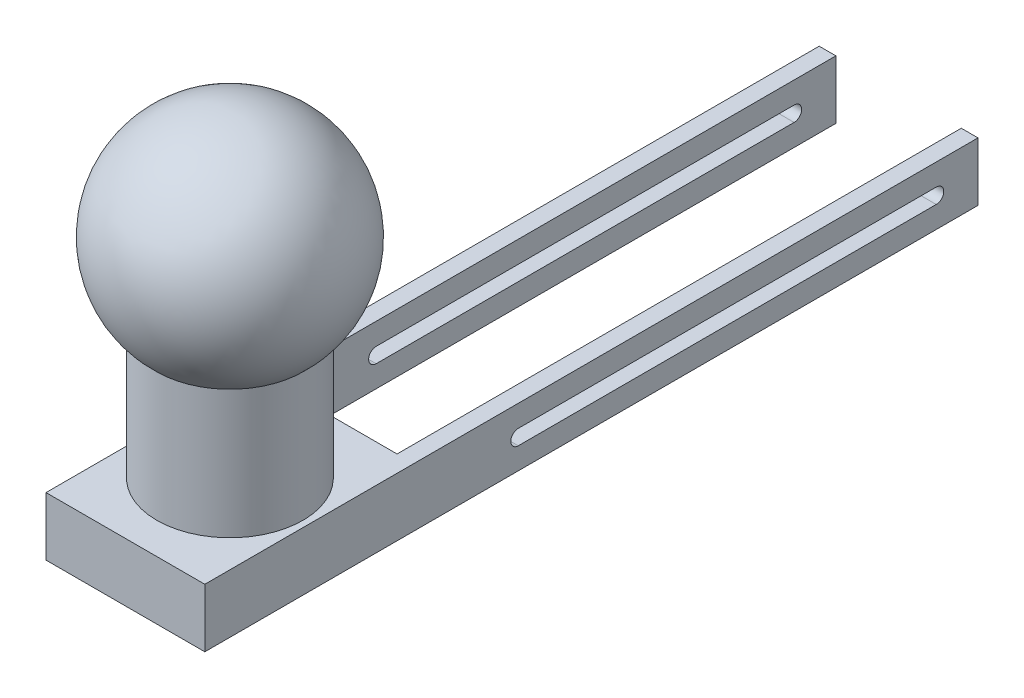
ISO-10303-21;
HEADER;
FILE_DESCRIPTION(('STEP AP214'),'2;1');
FILE_NAME('part.step','',(''),(''),'','','');
FILE_SCHEMA(('AUTOMOTIVE_DESIGN { 1 0 10303 214 1 1 1 1 }'));
ENDSEC;
DATA;
#1=APPLICATION_CONTEXT('core data for automotive mechanical design processes');
#2=APPLICATION_PROTOCOL_DEFINITION('international standard','automotive_design',2000,#1);
#3=PRODUCT_CONTEXT('',#1,'mechanical');
#4=PRODUCT('Part','Part','',(#3));
#5=PRODUCT_RELATED_PRODUCT_CATEGORY('part','',(#4));
#6=PRODUCT_DEFINITION_FORMATION('','',#4);
#7=PRODUCT_DEFINITION_CONTEXT('part definition',#1,'design');
#8=PRODUCT_DEFINITION('design','',#6,#7);
#9=PRODUCT_DEFINITION_SHAPE('','',#8);
#10=(LENGTH_UNIT() NAMED_UNIT(*) SI_UNIT(.MILLI.,.METRE.));
#11=(NAMED_UNIT(*) PLANE_ANGLE_UNIT() SI_UNIT($,.RADIAN.));
#12=(NAMED_UNIT(*) SI_UNIT($,.STERADIAN.) SOLID_ANGLE_UNIT());
#13=UNCERTAINTY_MEASURE_WITH_UNIT(LENGTH_MEASURE(1.E-05),#10,'distance_accuracy_value','');
#14=(GEOMETRIC_REPRESENTATION_CONTEXT(3) GLOBAL_UNCERTAINTY_ASSIGNED_CONTEXT((#13)) GLOBAL_UNIT_ASSIGNED_CONTEXT((#10,
#11,#12)) REPRESENTATION_CONTEXT('',''));
#15=CARTESIAN_POINT('',(0.,0.,0.));
#16=DIRECTION('',(0.,0.,1.));
#17=DIRECTION('',(1.,0.,0.));
#18=AXIS2_PLACEMENT_3D('',#15,#16,#17);
#19=CARTESIAN_POINT('',(0.,63.5,90.3111111111118));
#20=DIRECTION('',(0.,-1.,0.));
#21=DIRECTION('',(0.,0.,-1.));
#22=AXIS2_PLACEMENT_3D('',#19,#20,#21);
#23=CYLINDRICAL_SURFACE('',#22,22.225);
#24=CARTESIAN_POINT('',(0.,0.,90.3111111111118));
#25=DIRECTION('',(0.,1.,0.));
#26=DIRECTION('',(0.,0.,1.));
#27=AXIS2_PLACEMENT_3D('',#24,#25,#26);
#28=CIRCLE('',#27,22.225);
#29=CARTESIAN_POINT('',(0.,0.,112.536111111112));
#30=VERTEX_POINT('',#29);
#31=EDGE_CURVE('E203',#30,#30,#28,.T.);
#32=ORIENTED_EDGE('',*,*,#31,.T.);
#33=EDGE_LOOP('',(#32));
#34=FACE_BOUND('',#33,.T.);
#35=CARTESIAN_POINT('',(0.,39.0793166557527,90.3111111111118));
#36=DIRECTION('',(0.,1.,0.));
#37=DIRECTION('',(0.,0.,1.));
#38=AXIS2_PLACEMENT_3D('',#35,#36,#37);
#39=CIRCLE('',#38,22.225);
#40=CARTESIAN_POINT('',(0.,39.0793166557527,112.536111111112));
#41=VERTEX_POINT('',#40);
#42=EDGE_CURVE('E11',#41,#41,#39,.T.);
#43=ORIENTED_EDGE('',*,*,#42,.F.);
#44=EDGE_LOOP('',(#43));
#45=FACE_BOUND('',#44,.T.);
#46=ADVANCED_FACE('F32',(#34,#45),#23,.T.);
#47=CARTESIAN_POINT('',(-19.05,-17.78,58.5611111111118));
#48=DIRECTION('',(1.,0.,0.));
#49=DIRECTION('',(0.,0.,-1.));
#50=AXIS2_PLACEMENT_3D('',#47,#48,#49);
#51=PLANE('',#50);
#52=CARTESIAN_POINT('',(-19.05,-8.89000000000003,-100.188888888888));
#53=DIRECTION('',(1.,0.,0.));
#54=DIRECTION('',(0.,0.,-1.));
#55=AXIS2_PLACEMENT_3D('',#52,#53,#54);
#56=CIRCLE('',#55,2.286);
#57=CARTESIAN_POINT('',(-19.05,-11.176,-100.188888888888));
#58=VERTEX_POINT('',#57);
#59=CARTESIAN_POINT('',(-19.05,-6.60400000000003,-100.188888888888));
#60=VERTEX_POINT('',#59);
#61=EDGE_CURVE('E201',#58,#60,#56,.T.);
#62=ORIENTED_EDGE('',*,*,#61,.F.);
#63=DIRECTION('',(0.,0.,-1.));
#64=VECTOR('',#63,1.);
#65=CARTESIAN_POINT('',(-19.05,-11.176,58.5611111111118));
#66=LINE('',#65,#64);
#67=CARTESIAN_POINT('',(-19.05,-11.176,26.8111111111118));
#68=VERTEX_POINT('',#67);
#69=EDGE_CURVE('E183',#68,#58,#66,.T.);
#70=ORIENTED_EDGE('',*,*,#69,.F.);
#71=CARTESIAN_POINT('',(-19.05,-8.89000000000003,26.8111111111118));
#72=DIRECTION('',(1.,0.,0.));
#73=DIRECTION('',(0.,0.,-1.));
#74=AXIS2_PLACEMENT_3D('',#71,#72,#73);
#75=CIRCLE('',#74,2.286);
#76=CARTESIAN_POINT('',(-19.05,-6.60400000000003,26.8111111111118));
#77=VERTEX_POINT('',#76);
#78=EDGE_CURVE('E150',#77,#68,#75,.T.);
#79=ORIENTED_EDGE('',*,*,#78,.F.);
#80=DIRECTION('',(0.,0.,1.));
#81=VECTOR('',#80,1.);
#82=CARTESIAN_POINT('',(-19.05,-6.60400000000003,58.5611111111118));
#83=LINE('',#82,#81);
#84=EDGE_CURVE('E195',#60,#77,#83,.T.);
#85=ORIENTED_EDGE('',*,*,#84,.F.);
#86=EDGE_LOOP('',(#62,#70,#79,#85));
#87=FACE_BOUND('',#86,.T.);
#88=DIRECTION('',(0.,0.,-1.));
#89=VECTOR('',#88,1.);
#90=CARTESIAN_POINT('',(-19.05,0.,58.5611111111118));
#91=LINE('',#90,#89);
#92=CARTESIAN_POINT('',(-19.05,0.,58.5611111111118));
#93=VERTEX_POINT('',#92);
#94=CARTESIAN_POINT('',(-19.05,0.,-112.888888888888));
#95=VERTEX_POINT('',#94);
#96=EDGE_CURVE('E206',#93,#95,#91,.T.);
#97=ORIENTED_EDGE('',*,*,#96,.F.);
#98=DIRECTION('',(0.,1.,0.));
#99=VECTOR('',#98,1.);
#100=CARTESIAN_POINT('',(-19.05,-17.78,58.5611111111118));
#101=LINE('',#100,#99);
#102=CARTESIAN_POINT('',(-19.05,-17.78,58.5611111111118));
#103=VERTEX_POINT('',#102);
#104=EDGE_CURVE('E40',#103,#93,#101,.T.);
#105=ORIENTED_EDGE('',*,*,#104,.F.);
#106=DIRECTION('',(0.,0.,-1.));
#107=VECTOR('',#106,1.);
#108=CARTESIAN_POINT('',(-19.05,-17.78,58.5611111111118));
#109=LINE('',#108,#107);
#110=CARTESIAN_POINT('',(-19.05,-17.78,-112.888888888888));
#111=VERTEX_POINT('',#110);
#112=EDGE_CURVE('E207',#103,#111,#109,.T.);
#113=ORIENTED_EDGE('',*,*,#112,.T.);
#114=DIRECTION('',(0.,1.,0.));
#115=VECTOR('',#114,1.);
#116=CARTESIAN_POINT('',(-19.05,-17.78,-112.888888888888));
#117=LINE('',#116,#115);
#118=EDGE_CURVE('E232',#111,#95,#117,.T.);
#119=ORIENTED_EDGE('',*,*,#118,.T.);
#120=EDGE_LOOP('',(#97,#105,#113,#119));
#121=FACE_BOUND('',#120,.T.);
#122=ADVANCED_FACE('F34',(#87,#121),#51,.T.);
#123=CARTESIAN_POINT('',(19.05,-17.78,58.5611111111118));
#124=DIRECTION('',(0.,0.,-1.));
#125=DIRECTION('',(-1.,0.,0.));
#126=AXIS2_PLACEMENT_3D('',#123,#124,#125);
#127=PLANE('',#126);
#128=DIRECTION('',(-1.,0.,0.));
#129=VECTOR('',#128,1.);
#130=CARTESIAN_POINT('',(19.05,0.,58.5611111111118));
#131=LINE('',#130,#129);
#132=CARTESIAN_POINT('',(19.05,0.,58.5611111111118));
#133=VERTEX_POINT('',#132);
#134=EDGE_CURVE('E211',#133,#93,#131,.T.);
#135=ORIENTED_EDGE('',*,*,#134,.F.);
#136=DIRECTION('',(0.,1.,0.));
#137=VECTOR('',#136,1.);
#138=CARTESIAN_POINT('',(19.05,-17.78,58.5611111111118));
#139=LINE('',#138,#137);
#140=CARTESIAN_POINT('',(19.05,-17.78,58.5611111111118));
#141=VERTEX_POINT('',#140);
#142=EDGE_CURVE('E256',#141,#133,#139,.T.);
#143=ORIENTED_EDGE('',*,*,#142,.F.);
#144=DIRECTION('',(-1.,0.,0.));
#145=VECTOR('',#144,1.);
#146=CARTESIAN_POINT('',(19.05,-17.78,58.5611111111118));
#147=LINE('',#146,#145);
#148=EDGE_CURVE('E229',#141,#103,#147,.T.);
#149=ORIENTED_EDGE('',*,*,#148,.T.);
#150=ORIENTED_EDGE('',*,*,#104,.T.);
#151=EDGE_LOOP('',(#135,#143,#149,#150));
#152=FACE_BOUND('',#151,.T.);
#153=ADVANCED_FACE('F280',(#152),#127,.T.);
#154=CARTESIAN_POINT('',(19.05,-17.78,58.5611111111118));
#155=DIRECTION('',(-1.,0.,0.));
#156=DIRECTION('',(0.,0.,1.));
#157=AXIS2_PLACEMENT_3D('',#154,#155,#156);
#158=PLANE('',#157);
#159=CARTESIAN_POINT('',(19.05,-8.89000000000003,-100.188888888888));
#160=DIRECTION('',(-1.,0.,0.));
#161=DIRECTION('',(0.,0.,1.));
#162=AXIS2_PLACEMENT_3D('',#159,#160,#161);
#163=CIRCLE('',#162,2.286);
#164=CARTESIAN_POINT('',(19.05,-6.60400000000003,-100.188888888888));
#165=VERTEX_POINT('',#164);
#166=CARTESIAN_POINT('',(19.05,-11.176,-100.188888888888));
#167=VERTEX_POINT('',#166);
#168=EDGE_CURVE('E199',#165,#167,#163,.T.);
#169=ORIENTED_EDGE('',*,*,#168,.F.);
#170=DIRECTION('',(0.,0.,-1.));
#171=VECTOR('',#170,1.);
#172=CARTESIAN_POINT('',(19.05,-6.60400000000003,58.5611111111118));
#173=LINE('',#172,#171);
#174=CARTESIAN_POINT('',(19.05,-6.60400000000003,26.8111111111118));
#175=VERTEX_POINT('',#174);
#176=EDGE_CURVE('E193',#175,#165,#173,.T.);
#177=ORIENTED_EDGE('',*,*,#176,.F.);
#178=CARTESIAN_POINT('',(19.05,-8.89000000000003,26.8111111111118));
#179=DIRECTION('',(-1.,0.,0.));
#180=DIRECTION('',(0.,0.,1.));
#181=AXIS2_PLACEMENT_3D('',#178,#179,#180);
#182=CIRCLE('',#181,2.286);
#183=CARTESIAN_POINT('',(19.05,-11.176,26.8111111111118));
#184=VERTEX_POINT('',#183);
#185=EDGE_CURVE('E188',#184,#175,#182,.T.);
#186=ORIENTED_EDGE('',*,*,#185,.F.);
#187=DIRECTION('',(0.,0.,1.));
#188=VECTOR('',#187,1.);
#189=CARTESIAN_POINT('',(19.05,-11.176,58.5611111111118));
#190=LINE('',#189,#188);
#191=EDGE_CURVE('E181',#167,#184,#190,.T.);
#192=ORIENTED_EDGE('',*,*,#191,.F.);
#193=EDGE_LOOP('',(#169,#177,#186,#192));
#194=FACE_BOUND('',#193,.T.);
#195=DIRECTION('',(0.,0.,1.));
#196=VECTOR('',#195,1.);
#197=CARTESIAN_POINT('',(19.05,0.,58.5611111111118));
#198=LINE('',#197,#196);
#199=CARTESIAN_POINT('',(19.05,0.,-112.888888888888));
#200=VERTEX_POINT('',#199);
#201=EDGE_CURVE('E250',#200,#133,#198,.T.);
#202=ORIENTED_EDGE('',*,*,#201,.F.);
#203=DIRECTION('',(0.,1.,0.));
#204=VECTOR('',#203,1.);
#205=CARTESIAN_POINT('',(19.05,-17.78,-112.888888888888));
#206=LINE('',#205,#204);
#207=CARTESIAN_POINT('',(19.05,-17.78,-112.888888888888));
#208=VERTEX_POINT('',#207);
#209=EDGE_CURVE('E258',#208,#200,#206,.T.);
#210=ORIENTED_EDGE('',*,*,#209,.F.);
#211=DIRECTION('',(0.,0.,1.));
#212=VECTOR('',#211,1.);
#213=CARTESIAN_POINT('',(19.05,-17.78,58.5611111111118));
#214=LINE('',#213,#212);
#215=EDGE_CURVE('E226',#208,#141,#214,.T.);
#216=ORIENTED_EDGE('',*,*,#215,.T.);
#217=ORIENTED_EDGE('',*,*,#142,.T.);
#218=EDGE_LOOP('',(#202,#210,#216,#217));
#219=FACE_BOUND('',#218,.T.);
#220=ADVANCED_FACE('F299',(#194,#219),#158,.T.);
#221=CARTESIAN_POINT('',(19.05,-17.78,-112.888888888888));
#222=DIRECTION('',(0.,0.,-1.));
#223=DIRECTION('',(-1.,0.,0.));
#224=AXIS2_PLACEMENT_3D('',#221,#222,#223);
#225=PLANE('',#224);
#226=DIRECTION('',(-1.,0.,0.));
#227=VECTOR('',#226,1.);
#228=CARTESIAN_POINT('',(19.05,0.,-112.888888888888));
#229=LINE('',#228,#227);
#230=CARTESIAN_POINT('',(24.13,0.,-112.888888888888));
#231=VERTEX_POINT('',#230);
#232=EDGE_CURVE('E247',#231,#200,#229,.T.);
#233=ORIENTED_EDGE('',*,*,#232,.F.);
#234=DIRECTION('',(0.,1.,0.));
#235=VECTOR('',#234,1.);
#236=CARTESIAN_POINT('',(24.13,-17.78,-112.888888888888));
#237=LINE('',#236,#235);
#238=CARTESIAN_POINT('',(24.13,-17.78,-112.888888888888));
#239=VERTEX_POINT('',#238);
#240=EDGE_CURVE('E260',#239,#231,#237,.T.);
#241=ORIENTED_EDGE('',*,*,#240,.F.);
#242=DIRECTION('',(-1.,0.,0.));
#243=VECTOR('',#242,1.);
#244=CARTESIAN_POINT('',(19.05,-17.78,-112.888888888888));
#245=LINE('',#244,#243);
#246=EDGE_CURVE('E223',#239,#208,#245,.T.);
#247=ORIENTED_EDGE('',*,*,#246,.T.);
#248=ORIENTED_EDGE('',*,*,#209,.T.);
#249=EDGE_LOOP('',(#233,#241,#247,#248));
#250=FACE_BOUND('',#249,.T.);
#251=ADVANCED_FACE('F297',(#250),#225,.T.);
#252=CARTESIAN_POINT('',(24.13,-17.78,-112.888888888888));
#253=DIRECTION('',(1.,0.,0.));
#254=DIRECTION('',(0.,0.,-1.));
#255=AXIS2_PLACEMENT_3D('',#252,#253,#254);
#256=PLANE('',#255);
#257=CARTESIAN_POINT('',(24.13,-8.89000000000003,-100.188888888888));
#258=DIRECTION('',(1.,0.,0.));
#259=DIRECTION('',(0.,0.,-1.));
#260=AXIS2_PLACEMENT_3D('',#257,#258,#259);
#261=CIRCLE('',#260,2.286);
#262=CARTESIAN_POINT('',(24.13,-11.176,-100.188888888888));
#263=VERTEX_POINT('',#262);
#264=CARTESIAN_POINT('',(24.13,-6.60400000000003,-100.188888888888));
#265=VERTEX_POINT('',#264);
#266=EDGE_CURVE('E197',#263,#265,#261,.T.);
#267=ORIENTED_EDGE('',*,*,#266,.F.);
#268=DIRECTION('',(0.,0.,-1.));
#269=VECTOR('',#268,1.);
#270=CARTESIAN_POINT('',(24.13,-11.176,-112.888888888888));
#271=LINE('',#270,#269);
#272=CARTESIAN_POINT('',(24.13,-11.176,26.8111111111118));
#273=VERTEX_POINT('',#272);
#274=EDGE_CURVE('E179',#273,#263,#271,.T.);
#275=ORIENTED_EDGE('',*,*,#274,.F.);
#276=CARTESIAN_POINT('',(24.13,-8.89000000000003,26.8111111111118));
#277=DIRECTION('',(1.,0.,0.));
#278=DIRECTION('',(0.,0.,-1.));
#279=AXIS2_PLACEMENT_3D('',#276,#277,#278);
#280=CIRCLE('',#279,2.286);
#281=CARTESIAN_POINT('',(24.13,-6.60400000000003,26.8111111111118));
#282=VERTEX_POINT('',#281);
#283=EDGE_CURVE('E185',#282,#273,#280,.T.);
#284=ORIENTED_EDGE('',*,*,#283,.F.);
#285=DIRECTION('',(0.,0.,1.));
#286=VECTOR('',#285,1.);
#287=CARTESIAN_POINT('',(24.13,-6.60400000000003,-112.888888888888));
#288=LINE('',#287,#286);
#289=EDGE_CURVE('E191',#265,#282,#288,.T.);
#290=ORIENTED_EDGE('',*,*,#289,.F.);
#291=EDGE_LOOP('',(#267,#275,#284,#290));
#292=FACE_BOUND('',#291,.T.);
#293=DIRECTION('',(0.,0.,-1.));
#294=VECTOR('',#293,1.);
#295=CARTESIAN_POINT('',(24.13,0.,-112.888888888888));
#296=LINE('',#295,#294);
#297=CARTESIAN_POINT('',(24.13,0.,122.061111111112));
#298=VERTEX_POINT('',#297);
#299=EDGE_CURVE('E244',#298,#231,#296,.T.);
#300=ORIENTED_EDGE('',*,*,#299,.F.);
#301=DIRECTION('',(0.,1.,0.));
#302=VECTOR('',#301,1.);
#303=CARTESIAN_POINT('',(24.13,-17.78,122.061111111112));
#304=LINE('',#303,#302);
#305=CARTESIAN_POINT('',(24.13,-17.78,122.061111111112));
#306=VERTEX_POINT('',#305);
#307=EDGE_CURVE('E262',#306,#298,#304,.T.);
#308=ORIENTED_EDGE('',*,*,#307,.F.);
#309=DIRECTION('',(0.,0.,-1.));
#310=VECTOR('',#309,1.);
#311=CARTESIAN_POINT('',(24.13,-17.78,-112.888888888888));
#312=LINE('',#311,#310);
#313=EDGE_CURVE('E220',#306,#239,#312,.T.);
#314=ORIENTED_EDGE('',*,*,#313,.T.);
#315=ORIENTED_EDGE('',*,*,#240,.T.);
#316=EDGE_LOOP('',(#300,#308,#314,#315));
#317=FACE_BOUND('',#316,.T.);
#318=ADVANCED_FACE('F293',(#292,#317),#256,.T.);
#319=CARTESIAN_POINT('',(-24.13,-17.78,122.061111111112));
#320=DIRECTION('',(0.,0.,1.));
#321=DIRECTION('',(1.,0.,0.));
#322=AXIS2_PLACEMENT_3D('',#319,#320,#321);
#323=PLANE('',#322);
#324=DIRECTION('',(1.,0.,0.));
#325=VECTOR('',#324,1.);
#326=CARTESIAN_POINT('',(-24.13,0.,122.061111111112));
#327=LINE('',#326,#325);
#328=CARTESIAN_POINT('',(-24.13,0.,122.061111111112));
#329=VERTEX_POINT('',#328);
#330=EDGE_CURVE('E241',#329,#298,#327,.T.);
#331=ORIENTED_EDGE('',*,*,#330,.F.);
#332=DIRECTION('',(0.,1.,0.));
#333=VECTOR('',#332,1.);
#334=CARTESIAN_POINT('',(-24.13,-17.78,122.061111111112));
#335=LINE('',#334,#333);
#336=CARTESIAN_POINT('',(-24.13,-17.78,122.061111111112));
#337=VERTEX_POINT('',#336);
#338=EDGE_CURVE('E264',#337,#329,#335,.T.);
#339=ORIENTED_EDGE('',*,*,#338,.F.);
#340=DIRECTION('',(1.,0.,0.));
#341=VECTOR('',#340,1.);
#342=CARTESIAN_POINT('',(-24.13,-17.78,122.061111111112));
#343=LINE('',#342,#341);
#344=EDGE_CURVE('E217',#337,#306,#343,.T.);
#345=ORIENTED_EDGE('',*,*,#344,.T.);
#346=ORIENTED_EDGE('',*,*,#307,.T.);
#347=EDGE_LOOP('',(#331,#339,#345,#346));
#348=FACE_BOUND('',#347,.T.);
#349=ADVANCED_FACE('F291',(#348),#323,.T.);
#350=CARTESIAN_POINT('',(-24.13,-17.78,-112.888888888888));
#351=DIRECTION('',(-1.,0.,0.));
#352=DIRECTION('',(0.,0.,1.));
#353=AXIS2_PLACEMENT_3D('',#350,#351,#352);
#354=PLANE('',#353);
#355=CARTESIAN_POINT('',(-24.13,-8.89000000000003,-100.188888888888));
#356=DIRECTION('',(-1.,0.,0.));
#357=DIRECTION('',(0.,0.,1.));
#358=AXIS2_PLACEMENT_3D('',#355,#356,#357);
#359=CIRCLE('',#358,2.286);
#360=CARTESIAN_POINT('',(-24.13,-6.60400000000003,-100.188888888888));
#361=VERTEX_POINT('',#360);
#362=CARTESIAN_POINT('',(-24.13,-11.176,-100.188888888888));
#363=VERTEX_POINT('',#362);
#364=EDGE_CURVE('E162',#361,#363,#359,.T.);
#365=ORIENTED_EDGE('',*,*,#364,.F.);
#366=DIRECTION('',(0.,0.,-1.));
#367=VECTOR('',#366,1.);
#368=CARTESIAN_POINT('',(-24.13,-6.60400000000003,-100.188888888888));
#369=LINE('',#368,#367);
#370=CARTESIAN_POINT('',(-24.13,-6.60400000000003,26.8111111111118));
#371=VERTEX_POINT('',#370);
#372=EDGE_CURVE('E167',#371,#361,#369,.T.);
#373=ORIENTED_EDGE('',*,*,#372,.F.);
#374=CARTESIAN_POINT('',(-24.13,-8.89000000000003,26.8111111111118));
#375=DIRECTION('',(-1.,0.,0.));
#376=DIRECTION('',(0.,0.,1.));
#377=AXIS2_PLACEMENT_3D('',#374,#375,#376);
#378=CIRCLE('',#377,2.286);
#379=CARTESIAN_POINT('',(-24.13,-11.176,26.8111111111118));
#380=VERTEX_POINT('',#379);
#381=EDGE_CURVE('E147',#380,#371,#378,.T.);
#382=ORIENTED_EDGE('',*,*,#381,.F.);
#383=DIRECTION('',(0.,0.,1.));
#384=VECTOR('',#383,1.);
#385=CARTESIAN_POINT('',(-24.13,-11.176,-100.188888888888));
#386=LINE('',#385,#384);
#387=EDGE_CURVE('E156',#363,#380,#386,.T.);
#388=ORIENTED_EDGE('',*,*,#387,.F.);
#389=EDGE_LOOP('',(#365,#373,#382,#388));
#390=FACE_BOUND('',#389,.T.);
#391=DIRECTION('',(0.,0.,1.));
#392=VECTOR('',#391,1.);
#393=CARTESIAN_POINT('',(-24.13,0.,-112.888888888888));
#394=LINE('',#393,#392);
#395=CARTESIAN_POINT('',(-24.13,0.,-112.888888888888));
#396=VERTEX_POINT('',#395);
#397=EDGE_CURVE('E238',#396,#329,#394,.T.);
#398=ORIENTED_EDGE('',*,*,#397,.F.);
#399=DIRECTION('',(0.,1.,0.));
#400=VECTOR('',#399,1.);
#401=CARTESIAN_POINT('',(-24.13,-17.78,-112.888888888888));
#402=LINE('',#401,#400);
#403=CARTESIAN_POINT('',(-24.13,-17.78,-112.888888888888));
#404=VERTEX_POINT('',#403);
#405=EDGE_CURVE('E266',#404,#396,#402,.T.);
#406=ORIENTED_EDGE('',*,*,#405,.F.);
#407=DIRECTION('',(0.,0.,1.));
#408=VECTOR('',#407,1.);
#409=CARTESIAN_POINT('',(-24.13,-17.78,-112.888888888888));
#410=LINE('',#409,#408);
#411=EDGE_CURVE('E214',#404,#337,#410,.T.);
#412=ORIENTED_EDGE('',*,*,#411,.T.);
#413=ORIENTED_EDGE('',*,*,#338,.T.);
#414=EDGE_LOOP('',(#398,#406,#412,#413));
#415=FACE_BOUND('',#414,.T.);
#416=ADVANCED_FACE('F164',(#390,#415),#354,.T.);
#417=CARTESIAN_POINT('',(-19.05,-17.78,-112.888888888888));
#418=DIRECTION('',(0.,0.,-1.));
#419=DIRECTION('',(-1.,0.,0.));
#420=AXIS2_PLACEMENT_3D('',#417,#418,#419);
#421=PLANE('',#420);
#422=DIRECTION('',(-1.,0.,0.));
#423=VECTOR('',#422,1.);
#424=CARTESIAN_POINT('',(-19.05,0.,-112.888888888888));
#425=LINE('',#424,#423);
#426=EDGE_CURVE('E235',#95,#396,#425,.T.);
#427=ORIENTED_EDGE('',*,*,#426,.F.);
#428=ORIENTED_EDGE('',*,*,#118,.F.);
#429=DIRECTION('',(-1.,0.,0.));
#430=VECTOR('',#429,1.);
#431=CARTESIAN_POINT('',(-19.05,-17.78,-112.888888888888));
#432=LINE('',#431,#430);
#433=EDGE_CURVE('E210',#111,#404,#432,.T.);
#434=ORIENTED_EDGE('',*,*,#433,.T.);
#435=ORIENTED_EDGE('',*,*,#405,.T.);
#436=EDGE_LOOP('',(#427,#428,#434,#435));
#437=FACE_BOUND('',#436,.T.);
#438=ADVANCED_FACE('F273',(#437),#421,.T.);
#439=CARTESIAN_POINT('',(0.,-17.78,0.));
#440=DIRECTION('',(0.,1.,0.));
#441=DIRECTION('',(0.,0.,1.));
#442=AXIS2_PLACEMENT_3D('',#439,#440,#441);
#443=PLANE('',#442);
#444=ORIENTED_EDGE('',*,*,#112,.F.);
#445=ORIENTED_EDGE('',*,*,#148,.F.);
#446=ORIENTED_EDGE('',*,*,#215,.F.);
#447=ORIENTED_EDGE('',*,*,#246,.F.);
#448=ORIENTED_EDGE('',*,*,#313,.F.);
#449=ORIENTED_EDGE('',*,*,#344,.F.);
#450=ORIENTED_EDGE('',*,*,#411,.F.);
#451=ORIENTED_EDGE('',*,*,#433,.F.);
#452=EDGE_LOOP('',(#444,#445,#446,#447,#448,#449,#450,#451));
#453=FACE_BOUND('',#452,.T.);
#454=ADVANCED_FACE('F283',(#453),#443,.F.);
#455=CARTESIAN_POINT('',(0.,0.,0.));
#456=DIRECTION('',(0.,1.,0.));
#457=DIRECTION('',(0.,0.,1.));
#458=AXIS2_PLACEMENT_3D('',#455,#456,#457);
#459=PLANE('',#458);
#460=ORIENTED_EDGE('',*,*,#31,.F.);
#461=EDGE_LOOP('',(#460));
#462=FACE_BOUND('',#461,.T.);
#463=ORIENTED_EDGE('',*,*,#96,.T.);
#464=ORIENTED_EDGE('',*,*,#426,.T.);
#465=ORIENTED_EDGE('',*,*,#397,.T.);
#466=ORIENTED_EDGE('',*,*,#330,.T.);
#467=ORIENTED_EDGE('',*,*,#299,.T.);
#468=ORIENTED_EDGE('',*,*,#232,.T.);
#469=ORIENTED_EDGE('',*,*,#201,.T.);
#470=ORIENTED_EDGE('',*,*,#134,.T.);
#471=EDGE_LOOP('',(#463,#464,#465,#466,#467,#468,#469,#470));
#472=FACE_BOUND('',#471,.T.);
#473=ADVANCED_FACE('F276',(#462,#472),#459,.T.);
#474=CARTESIAN_POINT('',(0.,63.5,90.3111111111118));
#475=DIRECTION('',(-1.,0.,0.));
#476=DIRECTION('',(0.,1.,0.));
#477=AXIS2_PLACEMENT_3D('',#474,#475,#476);
#478=SPHERICAL_SURFACE('',#477,33.02);
#479=CARTESIAN_POINT('',(0.,63.5,90.3111111111118));
#480=DIRECTION('',(0.,1.,0.));
#481=DIRECTION('',(0.,0.,1.));
#482=AXIS2_PLACEMENT_3D('',#479,#480,#481);
#483=SPHERICAL_SURFACE('',#482,33.02);
#484=ORIENTED_EDGE('',*,*,#42,.T.);
#485=EDGE_LOOP('',(#484));
#486=FACE_BOUND('',#485,.T.);
#487=ADVANCED_FACE('F320',(#486),#483,.T.);
#488=CARTESIAN_POINT('',(33.02,-11.176,-100.188888888888));
#489=DIRECTION('',(0.,-1.,0.));
#490=DIRECTION('',(0.,0.,-1.));
#491=AXIS2_PLACEMENT_3D('',#488,#489,#490);
#492=PLANE('',#491);
#493=ORIENTED_EDGE('',*,*,#69,.T.);
#494=DIRECTION('',(-1.,0.,0.));
#495=VECTOR('',#494,1.);
#496=CARTESIAN_POINT('',(33.02,-11.176,-100.188888888888));
#497=LINE('',#496,#495);
#498=EDGE_CURVE('E159',#58,#363,#497,.T.);
#499=ORIENTED_EDGE('',*,*,#498,.T.);
#500=ORIENTED_EDGE('',*,*,#387,.T.);
#501=DIRECTION('',(-1.,0.,0.));
#502=VECTOR('',#501,1.);
#503=CARTESIAN_POINT('',(33.02,-11.176,26.8111111111118));
#504=LINE('',#503,#502);
#505=EDGE_CURVE('E47',#68,#380,#504,.T.);
#506=ORIENTED_EDGE('',*,*,#505,.F.);
#507=EDGE_LOOP('',(#493,#499,#500,#506));
#508=FACE_BOUND('',#507,.T.);
#509=ADVANCED_FACE('F157',(#508),#492,.F.);
#510=CARTESIAN_POINT('',(33.02,-8.89000000000003,26.8111111111118));
#511=DIRECTION('',(-1.,0.,0.));
#512=DIRECTION('',(0.,0.,1.));
#513=AXIS2_PLACEMENT_3D('',#510,#511,#512);
#514=CYLINDRICAL_SURFACE('',#513,2.286);
#515=ORIENTED_EDGE('',*,*,#78,.T.);
#516=ORIENTED_EDGE('',*,*,#505,.T.);
#517=ORIENTED_EDGE('',*,*,#381,.T.);
#518=DIRECTION('',(-1.,0.,0.));
#519=VECTOR('',#518,1.);
#520=CARTESIAN_POINT('',(33.02,-6.60400000000003,26.8111111111118));
#521=LINE('',#520,#519);
#522=EDGE_CURVE('E176',#77,#371,#521,.T.);
#523=ORIENTED_EDGE('',*,*,#522,.F.);
#524=EDGE_LOOP('',(#515,#516,#517,#523));
#525=FACE_BOUND('',#524,.T.);
#526=ADVANCED_FACE('F144',(#525),#514,.F.);
#527=CARTESIAN_POINT('',(33.02,-6.60400000000003,-100.188888888888));
#528=DIRECTION('',(0.,1.,0.));
#529=DIRECTION('',(0.,0.,1.));
#530=AXIS2_PLACEMENT_3D('',#527,#528,#529);
#531=PLANE('',#530);
#532=ORIENTED_EDGE('',*,*,#84,.T.);
#533=ORIENTED_EDGE('',*,*,#522,.T.);
#534=ORIENTED_EDGE('',*,*,#372,.T.);
#535=DIRECTION('',(-1.,0.,0.));
#536=VECTOR('',#535,1.);
#537=CARTESIAN_POINT('',(33.02,-6.60400000000003,-100.188888888888));
#538=LINE('',#537,#536);
#539=EDGE_CURVE('E172',#60,#361,#538,.T.);
#540=ORIENTED_EDGE('',*,*,#539,.F.);
#541=EDGE_LOOP('',(#532,#533,#534,#540));
#542=FACE_BOUND('',#541,.T.);
#543=ADVANCED_FACE('F340',(#542),#531,.F.);
#544=CARTESIAN_POINT('',(33.02,-8.89000000000003,-100.188888888888));
#545=DIRECTION('',(-1.,0.,0.));
#546=DIRECTION('',(0.,0.,1.));
#547=AXIS2_PLACEMENT_3D('',#544,#545,#546);
#548=CYLINDRICAL_SURFACE('',#547,2.286);
#549=ORIENTED_EDGE('',*,*,#61,.T.);
#550=ORIENTED_EDGE('',*,*,#539,.T.);
#551=ORIENTED_EDGE('',*,*,#364,.T.);
#552=ORIENTED_EDGE('',*,*,#498,.F.);
#553=EDGE_LOOP('',(#549,#550,#551,#552));
#554=FACE_BOUND('',#553,.T.);
#555=ADVANCED_FACE('F435',(#554),#548,.F.);
#556=ORIENTED_EDGE('',*,*,#168,.T.);
#557=EDGE_CURVE('E55',#263,#167,#497,.T.);
#558=ORIENTED_EDGE('',*,*,#557,.F.);
#559=ORIENTED_EDGE('',*,*,#266,.T.);
#560=EDGE_CURVE('E174',#265,#165,#538,.T.);
#561=ORIENTED_EDGE('',*,*,#560,.T.);
#562=EDGE_LOOP('',(#556,#558,#559,#561));
#563=FACE_BOUND('',#562,.T.);
#564=ADVANCED_FACE('F362',(#563),#548,.F.);
#565=ORIENTED_EDGE('',*,*,#176,.T.);
#566=ORIENTED_EDGE('',*,*,#560,.F.);
#567=ORIENTED_EDGE('',*,*,#289,.T.);
#568=EDGE_CURVE('E175',#282,#175,#521,.T.);
#569=ORIENTED_EDGE('',*,*,#568,.T.);
#570=EDGE_LOOP('',(#565,#566,#567,#569));
#571=FACE_BOUND('',#570,.T.);
#572=ADVANCED_FACE('F347',(#571),#531,.F.);
#573=ORIENTED_EDGE('',*,*,#185,.T.);
#574=ORIENTED_EDGE('',*,*,#568,.F.);
#575=ORIENTED_EDGE('',*,*,#283,.T.);
#576=EDGE_CURVE('E152',#273,#184,#504,.T.);
#577=ORIENTED_EDGE('',*,*,#576,.T.);
#578=EDGE_LOOP('',(#573,#574,#575,#577));
#579=FACE_BOUND('',#578,.T.);
#580=ADVANCED_FACE('F342',(#579),#514,.F.);
#581=ORIENTED_EDGE('',*,*,#191,.T.);
#582=ORIENTED_EDGE('',*,*,#576,.F.);
#583=ORIENTED_EDGE('',*,*,#274,.T.);
#584=ORIENTED_EDGE('',*,*,#557,.T.);
#585=EDGE_LOOP('',(#581,#582,#583,#584));
#586=FACE_BOUND('',#585,.T.);
#587=ADVANCED_FACE('F335',(#586),#492,.F.);
#588=CLOSED_SHELL('',(#46,#122,#153,#220,#251,#318,#349,#416,#438,#454,#473,#487,#509,#526,#543,
#555,#564,#572,#580,#587));
#589=MANIFOLD_SOLID_BREP('B2',#588);
#590=ADVANCED_BREP_SHAPE_REPRESENTATION('',(#18,#589),#14);
#591=SHAPE_DEFINITION_REPRESENTATION(#9,#590);
ENDSEC;
END-ISO-10303-21;
